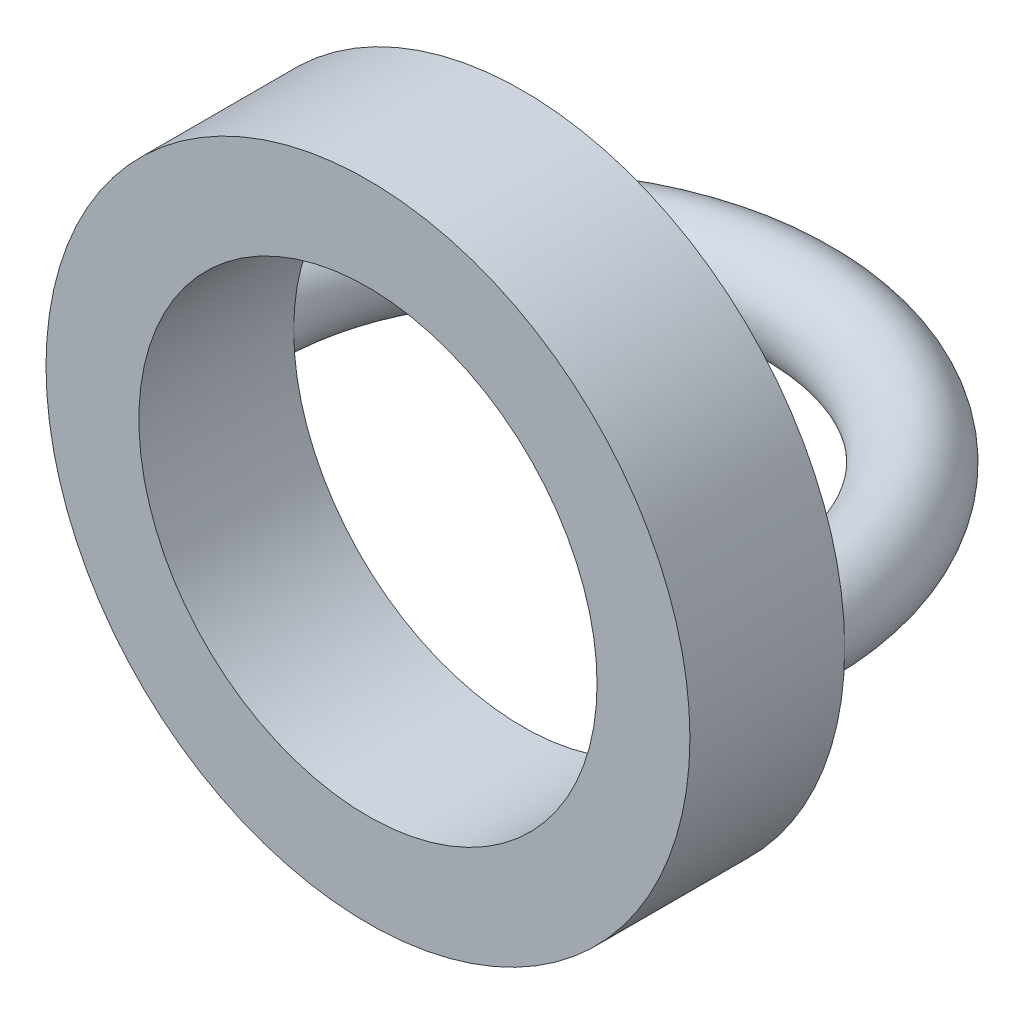
ISO-10303-21;
HEADER;
FILE_DESCRIPTION(('STEP AP214'),'2;1');
FILE_NAME('part.step','',(''),(''),'','','');
FILE_SCHEMA(('AUTOMOTIVE_DESIGN { 1 0 10303 214 1 1 1 1 }'));
ENDSEC;
DATA;
#1=APPLICATION_CONTEXT('core data for automotive mechanical design processes');
#2=APPLICATION_PROTOCOL_DEFINITION('international standard','automotive_design',2000,#1);
#3=PRODUCT_CONTEXT('',#1,'mechanical');
#4=PRODUCT('Part','Part','',(#3));
#5=PRODUCT_RELATED_PRODUCT_CATEGORY('part','',(#4));
#6=PRODUCT_DEFINITION_FORMATION('','',#4);
#7=PRODUCT_DEFINITION_CONTEXT('part definition',#1,'design');
#8=PRODUCT_DEFINITION('design','',#6,#7);
#9=PRODUCT_DEFINITION_SHAPE('','',#8);
#10=(LENGTH_UNIT() NAMED_UNIT(*) SI_UNIT(.MILLI.,.METRE.));
#11=(NAMED_UNIT(*) PLANE_ANGLE_UNIT() SI_UNIT($,.RADIAN.));
#12=(NAMED_UNIT(*) SI_UNIT($,.STERADIAN.) SOLID_ANGLE_UNIT());
#13=UNCERTAINTY_MEASURE_WITH_UNIT(LENGTH_MEASURE(1.E-05),#10,'distance_accuracy_value','');
#14=(GEOMETRIC_REPRESENTATION_CONTEXT(3) GLOBAL_UNCERTAINTY_ASSIGNED_CONTEXT((#13)) GLOBAL_UNIT_ASSIGNED_CONTEXT((#10,
#11,#12)) REPRESENTATION_CONTEXT('',''));
#15=CARTESIAN_POINT('',(0.,0.,0.));
#16=DIRECTION('',(0.,0.,1.));
#17=DIRECTION('',(1.,0.,0.));
#18=AXIS2_PLACEMENT_3D('',#15,#16,#17);
#19=CARTESIAN_POINT('',(0.,0.,0.));
#20=DIRECTION('',(0.,0.,1.));
#21=DIRECTION('',(1.,0.,0.));
#22=AXIS2_PLACEMENT_3D('',#19,#20,#21);
#23=PLANE('',#22);
#24=CARTESIAN_POINT('',(0.,0.,0.));
#25=DIRECTION('',(0.,0.,1.));
#26=DIRECTION('',(1.,0.,0.));
#27=AXIS2_PLACEMENT_3D('',#24,#25,#26);
#28=CIRCLE('',#27,10.4);
#29=CARTESIAN_POINT('',(10.4,0.,0.));
#30=VERTEX_POINT('',#29);
#31=CARTESIAN_POINT('',(-10.4,0.,0.));
#32=VERTEX_POINT('',#31);
#33=EDGE_CURVE('E39',#30,#32,#28,.T.);
#34=ORIENTED_EDGE('',*,*,#33,.F.);
#35=CARTESIAN_POINT('',(8.9,0.,0.));
#36=DIRECTION('',(0.,0.,1.));
#37=DIRECTION('',(1.,0.,0.));
#38=AXIS2_PLACEMENT_3D('',#35,#36,#37);
#39=CIRCLE('',#38,1.5);
#40=CARTESIAN_POINT('',(7.4,0.,0.));
#41=VERTEX_POINT('',#40);
#42=EDGE_CURVE('E49',#30,#41,#39,.T.);
#43=ORIENTED_EDGE('',*,*,#42,.T.);
#44=CARTESIAN_POINT('',(0.,0.,0.));
#45=DIRECTION('',(0.,0.,1.));
#46=DIRECTION('',(1.,0.,0.));
#47=AXIS2_PLACEMENT_3D('',#44,#45,#46);
#48=CIRCLE('',#47,7.4);
#49=CARTESIAN_POINT('',(-7.4,0.,0.));
#50=VERTEX_POINT('',#49);
#51=EDGE_CURVE('E76',#41,#50,#48,.T.);
#52=ORIENTED_EDGE('',*,*,#51,.T.);
#53=CARTESIAN_POINT('',(-8.9,0.,0.));
#54=DIRECTION('',(0.,0.,-1.));
#55=DIRECTION('',(-1.,0.,0.));
#56=AXIS2_PLACEMENT_3D('',#53,#54,#55);
#57=CIRCLE('',#56,1.5);
#58=EDGE_CURVE('E74',#32,#50,#57,.T.);
#59=ORIENTED_EDGE('',*,*,#58,.F.);
#60=EDGE_LOOP('',(#34,#43,#52,#59));
#61=FACE_BOUND('',#60,.T.);
#62=ADVANCED_FACE('F35',(#61),#23,.F.);
#63=EDGE_CURVE('E82',#50,#41,#48,.T.);
#64=ORIENTED_EDGE('',*,*,#63,.T.);
#65=EDGE_CURVE('E70',#41,#30,#39,.T.);
#66=ORIENTED_EDGE('',*,*,#65,.T.);
#67=EDGE_CURVE('E66',#32,#30,#28,.T.);
#68=ORIENTED_EDGE('',*,*,#67,.F.);
#69=EDGE_CURVE('E57',#50,#32,#57,.T.);
#70=ORIENTED_EDGE('',*,*,#69,.F.);
#71=EDGE_LOOP('',(#64,#66,#68,#70));
#72=FACE_BOUND('',#71,.T.);
#73=ADVANCED_FACE('F69',(#72),#23,.F.);
#74=CARTESIAN_POINT('',(0.,0.,5.));
#75=DIRECTION('',(0.,0.,1.));
#76=DIRECTION('',(1.,0.,0.));
#77=AXIS2_PLACEMENT_3D('',#74,#75,#76);
#78=PLANE('',#77);
#79=CARTESIAN_POINT('',(0.,0.,5.));
#80=DIRECTION('',(0.,0.,1.));
#81=DIRECTION('',(1.,0.,0.));
#82=AXIS2_PLACEMENT_3D('',#79,#80,#81);
#83=CIRCLE('',#82,10.4);
#84=CARTESIAN_POINT('',(10.4,0.,5.));
#85=VERTEX_POINT('',#84);
#86=EDGE_CURVE('E11',#85,#85,#83,.T.);
#87=ORIENTED_EDGE('',*,*,#86,.T.);
#88=EDGE_LOOP('',(#87));
#89=FACE_BOUND('',#88,.T.);
#90=CARTESIAN_POINT('',(0.,0.,5.));
#91=DIRECTION('',(0.,0.,1.));
#92=DIRECTION('',(1.,0.,0.));
#93=AXIS2_PLACEMENT_3D('',#90,#91,#92);
#94=CIRCLE('',#93,7.4);
#95=CARTESIAN_POINT('',(7.4,0.,5.));
#96=VERTEX_POINT('',#95);
#97=EDGE_CURVE('E71',#96,#96,#94,.T.);
#98=ORIENTED_EDGE('',*,*,#97,.F.);
#99=EDGE_LOOP('',(#98));
#100=FACE_BOUND('',#99,.T.);
#101=ADVANCED_FACE('F95',(#89,#100),#78,.T.);
#102=CARTESIAN_POINT('',(0.,0.,5.));
#103=DIRECTION('',(0.,0.,-1.));
#104=DIRECTION('',(-1.,0.,0.));
#105=AXIS2_PLACEMENT_3D('',#102,#103,#104);
#106=CYLINDRICAL_SURFACE('',#105,10.4);
#107=ORIENTED_EDGE('',*,*,#86,.F.);
#108=EDGE_LOOP('',(#107));
#109=FACE_BOUND('',#108,.T.);
#110=ORIENTED_EDGE('',*,*,#33,.T.);
#111=ORIENTED_EDGE('',*,*,#67,.T.);
#112=EDGE_LOOP('',(#110,#111));
#113=FACE_BOUND('',#112,.T.);
#114=ADVANCED_FACE('F37',(#109,#113),#106,.T.);
#115=CARTESIAN_POINT('',(0.,0.,5.));
#116=DIRECTION('',(0.,0.,-1.));
#117=DIRECTION('',(-1.,0.,0.));
#118=AXIS2_PLACEMENT_3D('',#115,#116,#117);
#119=CYLINDRICAL_SURFACE('',#118,7.4);
#120=ORIENTED_EDGE('',*,*,#97,.T.);
#121=EDGE_LOOP('',(#120));
#122=FACE_BOUND('',#121,.T.);
#123=ORIENTED_EDGE('',*,*,#51,.F.);
#124=ORIENTED_EDGE('',*,*,#63,.F.);
#125=EDGE_LOOP('',(#123,#124));
#126=FACE_BOUND('',#125,.T.);
#127=ADVANCED_FACE('F86',(#122,#126),#119,.F.);
#128=CARTESIAN_POINT('',(0.,0.,0.));
#129=DIRECTION('',(0.,-1.,0.));
#130=DIRECTION('',(0.,0.,-1.));
#131=AXIS2_PLACEMENT_3D('',#128,#129,#130);
#132=TOROIDAL_SURFACE('',#131,8.9,1.5);
#133=ORIENTED_EDGE('',*,*,#42,.F.);
#134=ORIENTED_EDGE('',*,*,#65,.F.);
#135=EDGE_LOOP('',(#133,#134));
#136=FACE_BOUND('',#135,.T.);
#137=ORIENTED_EDGE('',*,*,#58,.T.);
#138=ORIENTED_EDGE('',*,*,#69,.T.);
#139=EDGE_LOOP('',(#137,#138));
#140=FACE_BOUND('',#139,.T.);
#141=ADVANCED_FACE('F79',(#136,#140),#132,.T.);
#142=CLOSED_SHELL('',(#62,#73,#101,#114,#127,#141));
#143=MANIFOLD_SOLID_BREP('B2',#142);
#144=ADVANCED_BREP_SHAPE_REPRESENTATION('',(#18,#143),#14);
#145=SHAPE_DEFINITION_REPRESENTATION(#9,#144);
ENDSEC;
END-ISO-10303-21;
